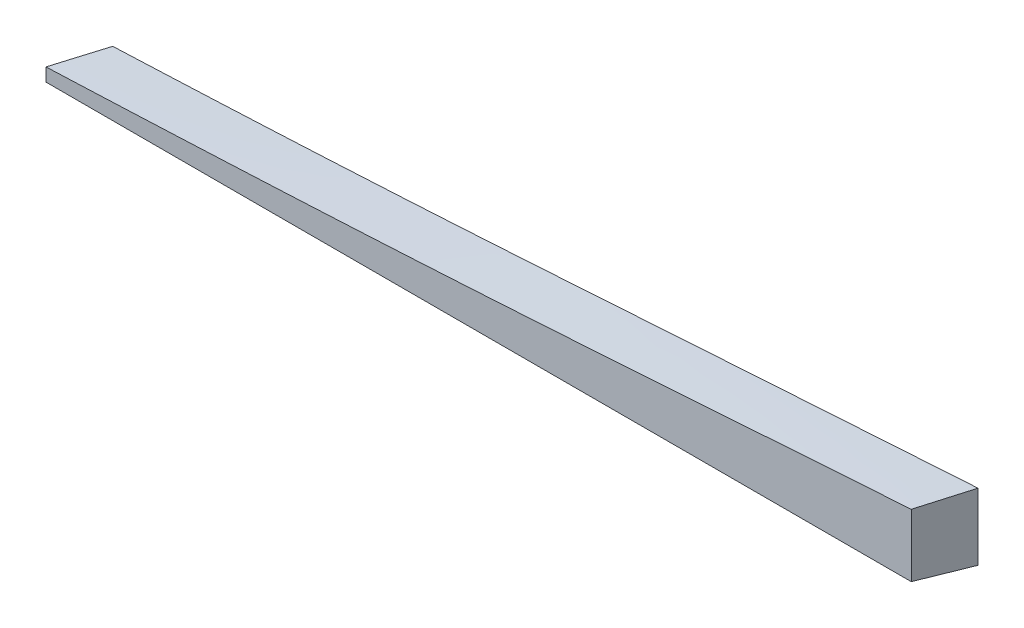
ISO-10303-21;
HEADER;
FILE_DESCRIPTION(('STEP AP214'),'2;1');
FILE_NAME('part.step','',(''),(''),'','','');
FILE_SCHEMA(('AUTOMOTIVE_DESIGN { 1 0 10303 214 1 1 1 1 }'));
ENDSEC;
DATA;
#1=APPLICATION_CONTEXT('core data for automotive mechanical design processes');
#2=APPLICATION_PROTOCOL_DEFINITION('international standard','automotive_design',2000,#1);
#3=PRODUCT_CONTEXT('',#1,'mechanical');
#4=PRODUCT('Part','Part','',(#3));
#5=PRODUCT_RELATED_PRODUCT_CATEGORY('part','',(#4));
#6=PRODUCT_DEFINITION_FORMATION('','',#4);
#7=PRODUCT_DEFINITION_CONTEXT('part definition',#1,'design');
#8=PRODUCT_DEFINITION('design','',#6,#7);
#9=PRODUCT_DEFINITION_SHAPE('','',#8);
#10=(LENGTH_UNIT() NAMED_UNIT(*) SI_UNIT(.MILLI.,.METRE.));
#11=(NAMED_UNIT(*) PLANE_ANGLE_UNIT() SI_UNIT($,.RADIAN.));
#12=(NAMED_UNIT(*) SI_UNIT($,.STERADIAN.) SOLID_ANGLE_UNIT());
#13=UNCERTAINTY_MEASURE_WITH_UNIT(LENGTH_MEASURE(1.E-05),#10,'distance_accuracy_value','');
#14=(GEOMETRIC_REPRESENTATION_CONTEXT(3) GLOBAL_UNCERTAINTY_ASSIGNED_CONTEXT((#13)) GLOBAL_UNIT_ASSIGNED_CONTEXT((#10,
#11,#12)) REPRESENTATION_CONTEXT('',''));
#15=CARTESIAN_POINT('',(0.,0.,0.));
#16=DIRECTION('',(0.,0.,1.));
#17=DIRECTION('',(1.,0.,0.));
#18=AXIS2_PLACEMENT_3D('',#15,#16,#17);
#19=CARTESIAN_POINT('',(-197.742614302347,198.003452270729,-9.08995101411847E-13));
#20=DIRECTION('',(0.,0.,-1.));
#21=DIRECTION('',(-1.,0.,0.));
#22=AXIS2_PLACEMENT_3D('',#19,#20,#21);
#23=PLANE('',#22);
#24=CARTESIAN_POINT('',(-197.742614302347,2.8129648914349,-9.12491653418113E-13));
#25=CARTESIAN_POINT('',(-193.850951140928,2.970598903806,-9.1065830887559E-13));
#26=CARTESIAN_POINT('',(-189.959390433493,3.13081655935987,-9.09535325993361E-13));
#27=CARTESIAN_POINT('',(-182.176532112172,3.45764586709549,-9.08454876033607E-13));
#28=CARTESIAN_POINT('',(-178.285234498681,3.62425752870681,-9.08497410674991E-13));
#29=CARTESIAN_POINT('',(-170.502882666963,3.96510501497694,-9.09492803578593E-13));
#30=CARTESIAN_POINT('',(-166.611828456378,4.13934101464326,-9.10445682747141E-13));
#31=CARTESIAN_POINT('',(-158.830114325608,4.49637709232704,-9.07544520795331E-13));
#32=CARTESIAN_POINT('',(-154.939454405229,4.67917716610088,-9.03690482056849E-13));
#33=CARTESIAN_POINT('',(-147.158567150717,5.05419239235506,-9.03810065062905E-13));
#34=CARTESIAN_POINT('',(-143.26833981897,5.24640759440964,-9.07783728027592E-13));
#35=CARTESIAN_POINT('',(-135.488394625437,5.64091834252697,-9.10206475182148E-13));
#36=CARTESIAN_POINT('',(-131.598676763815,5.84321389180216,-9.08655557611417E-13));
#37=CARTESIAN_POINT('',(-123.819868027069,6.25864055648807,-9.09334640895902E-13));
#38=CARTESIAN_POINT('',(-119.930777144604,6.47177153412137,-9.11564593687281E-13));
#39=CARTESIAN_POINT('',(-114.097621039609,6.79997309015596,-9.07710355376294E-13));
#40=CARTESIAN_POINT('',(-112.153315785025,6.91079111918968,-9.05225748264865E-13));
#41=CARTESIAN_POINT('',(-108.264873033624,7.13533107203409,-9.12764454165497E-13));
#42=CARTESIAN_POINT('',(-106.320735536789,7.24905299554175,-9.22787765872354E-13));
#43=CARTESIAN_POINT('',(-101.832633358921,7.51513272768922,-9.26238225673459E-13));
#44=CARTESIAN_POINT('',(-99.2887332785469,7.66858215322048,-9.13588351356553E-13));
#45=CARTESIAN_POINT('',(-94.20126826513,7.98094006469983,-9.04401850976139E-13));
#46=CARTESIAN_POINT('',(-91.657703332123,8.13984855123147,-9.07865226635083E-13));
#47=CARTESIAN_POINT('',(-86.5708797226157,8.46247367310467,-9.10124975810608E-13));
#48=CARTESIAN_POINT('',(-84.0276210460131,8.62619030683763,-9.08921350888552E-13));
#49=CARTESIAN_POINT('',(-78.9413429638491,8.95775494174865,-9.09068852816083E-13));
#50=CARTESIAN_POINT('',(-76.3983235615085,9.12560299225199,-9.10420010182015E-13));
#51=CARTESIAN_POINT('',(-71.3124874369092,9.464342115984,-9.07570192385291E-13));
#52=CARTESIAN_POINT('',(-68.7696707146869,9.63523318976021,-9.03369216223621E-13));
#53=CARTESIAN_POINT('',(-63.6841689786656,9.97897729744824,-9.1462098925975E-13));
#54=CARTESIAN_POINT('',(-61.1414839649294,10.1518303322876,-9.30073747748984E-13));
#55=CARTESIAN_POINT('',(-54.7847643684682,10.5848417786177,-9.38634644505636E-13));
#56=CARTESIAN_POINT('',(-50.9707596162146,10.845437374839,-9.16706291227796E-13));
#57=CARTESIAN_POINT('',(-43.3425819601253,11.3641287405294,-9.01283915997106E-13));
#58=CARTESIAN_POINT('',(-39.5284090563868,11.6222245114251,-9.07789877815203E-13));
#59=CARTESIAN_POINT('',(-33.807046215106,12.0072521836717,-9.09597701010719E-13));
#60=CARTESIAN_POINT('',(-31.8999273256475,12.1352407922212,-9.08875169708536E-13));
#61=CARTESIAN_POINT('',(-28.0856388461497,12.39046056853,-9.09115033115358E-13));
#62=CARTESIAN_POINT('',(-26.1784692561105,12.517691736288,-9.1007742782716E-13));
#63=CARTESIAN_POINT('',(-22.3640799809754,12.7714342623534,-9.07912773738724E-13));
#64=CARTESIAN_POINT('',(-20.456860295824,12.8979456198243,-9.04785720185998E-13));
#65=CARTESIAN_POINT('',(-16.6423777220762,13.150315227023,-9.13204482614435E-13));
#66=CARTESIAN_POINT('',(-14.73511483348,13.2761734767545,-9.24750298514519E-13));
#67=CARTESIAN_POINT('',(-12.827832670275,13.4017385987262,-9.53013709614758E-13));
#68=B_SPLINE_CURVE_WITH_KNOTS('',3,(#24,#25,#26,#27,#28,#29,#30,#31,#32,#33,#34,#35,#36,#37,#38,
#39,#40,#41,#42,#43,#44,#45,#46,#47,#48,#49,#50,#51,#52,#53,#54,#55,#56,#57,#58,#59,#60,#61,#62,
#63,#64,#65,#66,#67),.UNSPECIFIED.,.F.,.F.,(4,2,2,2,2,2,2,2,2,2,2,2,2,2,2,2,2,2,2,2,2,4),(0.,
11.6845656108452,23.3691484541407,35.0539996437825,46.7388450434628,58.4237519749159,
70.1086626301718,81.7934247435949,87.6358053357163,93.4781853181843,101.123751133811,
108.769317766723,116.414881841782,124.060537242098,131.706194018122,139.351854408683,
150.820545616287,162.289230278067,168.023456521248,173.757682773945,179.49191569059,
185.226148575548),.UNSPECIFIED.);
#69=CARTESIAN_POINT('',(-197.742614302347,2.81296489143491,-8.84763182856796E-13));
#70=VERTEX_POINT('',#69);
#71=CARTESIAN_POINT('',(-12.827832670275,13.4017385987261,-9.08995101411847E-13));
#72=VERTEX_POINT('',#71);
#73=EDGE_CURVE('E50',#70,#72,#68,.T.);
#74=ORIENTED_EDGE('',*,*,#73,.F.);
#75=DIRECTION('',(0.,-1.,0.));
#76=VECTOR('',#75,1.);
#77=CARTESIAN_POINT('',(-197.742614302347,198.003452270729,-9.08995101411847E-13));
#78=LINE('',#77,#76);
#79=CARTESIAN_POINT('',(-197.742614302347,0.,-9.08995101411847E-13));
#80=VERTEX_POINT('',#79);
#81=EDGE_CURVE('E58',#70,#80,#78,.T.);
#82=ORIENTED_EDGE('',*,*,#81,.T.);
#83=DIRECTION('',(1.,0.,0.));
#84=VECTOR('',#83,1.);
#85=CARTESIAN_POINT('',(-197.742614302347,0.,-9.08995101411847E-13));
#86=LINE('',#85,#84);
#87=CARTESIAN_POINT('',(-12.827832670275,0.,-9.08995101411847E-13));
#88=VERTEX_POINT('',#87);
#89=EDGE_CURVE('E92',#80,#88,#86,.T.);
#90=ORIENTED_EDGE('',*,*,#89,.T.);
#91=DIRECTION('',(0.,-1.,0.));
#92=VECTOR('',#91,1.);
#93=CARTESIAN_POINT('',(-12.827832670275,198.003452270729,-9.08995101411847E-13));
#94=LINE('',#93,#92);
#95=EDGE_CURVE('E81',#72,#88,#94,.T.);
#96=ORIENTED_EDGE('',*,*,#95,.F.);
#97=EDGE_LOOP('',(#74,#82,#90,#96));
#98=FACE_BOUND('',#97,.T.);
#99=ADVANCED_FACE('F37',(#98),#23,.F.);
#100=CARTESIAN_POINT('',(-12.827832670275,198.003452270729,-9.08995101411847E-13));
#101=DIRECTION('',(-0.927183854566787,0.,-0.374606593415914));
#102=DIRECTION('',(-0.374606593415914,0.,0.927183854566787));
#103=AXIS2_PLACEMENT_3D('',#100,#101,#102);
#104=PLANE('',#103);
#105=CARTESIAN_POINT('',(55.4579622929114,-12.2355937801034,-169.013273388462));
#106=CARTESIAN_POINT('',(54.0571308051934,-8.60514732719382,-165.54609378936));
#107=CARTESIAN_POINT('',(51.0184814142201,-2.46786226068883,-158.02517262962));
#108=CARTESIAN_POINT('',(45.8041521424564,4.76714030137632,-145.119254799694));
#109=CARTESIAN_POINT('',(38.9234282314708,9.23952699906756,-128.088865505627));
#110=CARTESIAN_POINT('',(30.1300986569033,14.0639848646941,-106.324611077859));
#111=CARTESIAN_POINT('',(18.8078079555876,18.3278371209846,-78.300958212475));
#112=CARTESIAN_POINT('',(9.36093531552081,17.7841951964629,-54.9191279351479));
#113=CARTESIAN_POINT('',(-2.59669205365653,15.2071354720517,-25.3229616356465));
#114=CARTESIAN_POINT('',(-12.2538419080908,14.0608222999372,-1.42067698946542));
#115=CARTESIAN_POINT('',(-30.8844858051684,7.32123956202061,44.6917847908712));
#116=CARTESIAN_POINT('',(-70.3636495182564,-3.48123407166318,142.406143881004));
#117=CARTESIAN_POINT('',(-96.9055824868118,-11.6348174747197,208.099733235731));
#118=CARTESIAN_POINT('',(-113.639406371974,-16.8338696421729,249.517400741279));
#119=B_SPLINE_CURVE_WITH_KNOTS('',3,(#105,#106,#107,#108,#109,#110,#111,#112,#113,#114,#115,
#116,#117,#118),.UNSPECIFIED.,.F.,.F.,(4,1,1,1,1,1,1,1,1,1,1,4),(0.,0.0394948802864952,
0.0758203782734546,0.117565574528788,0.181239187941656,0.256865620502935,0.346598051719973,
0.372016828557867,0.495604882179206,0.537891492765754,0.752596323836803,1.),.UNSPECIFIED.);
#120=CARTESIAN_POINT('',(-8.72292621578977,14.284296480979,-10.1600000000009));
#121=VERTEX_POINT('',#120);
#122=EDGE_CURVE('E87',#121,#72,#119,.T.);
#123=ORIENTED_EDGE('',*,*,#122,.T.);
#124=ORIENTED_EDGE('',*,*,#95,.T.);
#125=DIRECTION('',(0.374606593415914,0.,-0.927183854566787));
#126=VECTOR('',#125,1.);
#127=CARTESIAN_POINT('',(-12.827832670275,0.,-9.08995101411847E-13));
#128=LINE('',#127,#126);
#129=CARTESIAN_POINT('',(-8.72292621578977,0.,-10.1600000000009));
#130=VERTEX_POINT('',#129);
#131=EDGE_CURVE('E105',#88,#130,#128,.T.);
#132=ORIENTED_EDGE('',*,*,#131,.T.);
#133=DIRECTION('',(0.,-1.,0.));
#134=VECTOR('',#133,1.);
#135=CARTESIAN_POINT('',(-8.72292621578977,198.003452270729,-10.1600000000009));
#136=LINE('',#135,#134);
#137=EDGE_CURVE('E149',#121,#130,#136,.T.);
#138=ORIENTED_EDGE('',*,*,#137,.F.);
#139=EDGE_LOOP('',(#123,#124,#132,#138));
#140=FACE_BOUND('',#139,.T.);
#141=ADVANCED_FACE('F131',(#140),#104,.F.);
#142=CARTESIAN_POINT('',(-8.72292621578977,198.003452270729,-10.1600000000009));
#143=DIRECTION('',(0.,0.,1.));
#144=DIRECTION('',(1.,0.,0.));
#145=AXIS2_PLACEMENT_3D('',#142,#143,#144);
#146=PLANE('',#145);
#147=CARTESIAN_POINT('',(-8.72292621578978,14.284296480979,-10.1600000000009));
#148=CARTESIAN_POINT('',(-11.3143587305136,14.1210374299961,-10.1600000000009));
#149=CARTESIAN_POINT('',(-13.9057884039131,13.9577330843458,-10.1600000000009));
#150=CARTESIAN_POINT('',(-19.0886336818386,13.6308988818998,-10.1600000000009));
#151=CARTESIAN_POINT('',(-21.6800492863638,13.4673690250908,-10.1600000000009));
#152=CARTESIAN_POINT('',(-26.8628577810833,13.1399488948078,-10.1600000000009));
#153=CARTESIAN_POINT('',(-29.4542506712773,12.9760586213272,-10.1600000000009));
#154=CARTESIAN_POINT('',(-34.637029949751,12.6478273912623,-10.1600000000009));
#155=CARTESIAN_POINT('',(-37.2284163377898,12.4834864308725,-10.1600000000009));
#156=CARTESIAN_POINT('',(-42.4111565119058,12.1542919159894,-10.1600000000009));
#157=CARTESIAN_POINT('',(-45.0025102979836,11.9894383615055,-10.1600000000009));
#158=CARTESIAN_POINT('',(-50.1851801243023,11.6591393240694,-10.1600000000009));
#159=CARTESIAN_POINT('',(-52.7764961645436,11.4936938411236,-10.1600000000009));
#160=CARTESIAN_POINT('',(-57.9590858298187,11.1621086972605,-10.1600000000009));
#161=CARTESIAN_POINT('',(-60.5503594548186,10.9959690358126,-10.1600000000009));
#162=CARTESIAN_POINT('',(-65.7328585741149,10.6629400964496,-10.1600000000009));
#163=CARTESIAN_POINT('',(-68.3240840684103,10.4960508185211,-10.1600000000009));
#164=CARTESIAN_POINT('',(-73.5064999961304,10.1617287174523,-10.1600000000009));
#165=CARTESIAN_POINT('',(-76.0976904295548,9.99429589430674,-10.1600000000009));
#166=CARTESIAN_POINT('',(-79.9844485970235,9.74292607750322,-10.1600000000009));
#167=CARTESIAN_POINT('',(-81.2800234918128,9.65909980122976,-10.1600000000009));
#168=CARTESIAN_POINT('',(-83.8711733761386,9.49144875061907,-10.1600000000009));
#169=CARTESIAN_POINT('',(-85.1667483656751,9.40762397628184,-10.1600000000009));
#170=CARTESIAN_POINT('',(-89.0534915682424,9.1564316101769,-10.1600000000009));
#171=CARTESIAN_POINT('',(-91.6446780964067,8.98934597004608,-10.1600000000009));
#172=CARTESIAN_POINT('',(-96.827188616671,8.65730125483761,-10.1600000000009));
#173=CARTESIAN_POINT('',(-99.4185126088315,8.49234218070395,-10.1600000000009));
#174=CARTESIAN_POINT('',(-105.8252034345,8.08870625543938,-10.1600000000009));
#175=CARTESIAN_POINT('',(-109.640695761392,7.85200613869954,-10.1600000000009));
#176=CARTESIAN_POINT('',(-115.364424034412,7.50501342356376,-10.1600000000009));
#177=CARTESIAN_POINT('',(-117.272415812547,7.39069205337269,-10.1600000000009));
#178=CARTESIAN_POINT('',(-121.088572059878,7.16496748653493,-10.1600000000009));
#179=CARTESIAN_POINT('',(-122.996736529067,7.05356428974446,-10.1600000000009));
#180=CARTESIAN_POINT('',(-126.813247749074,6.83392154272504,-10.1600000000009));
#181=CARTESIAN_POINT('',(-128.721594499906,6.72568199272073,-10.1600000000009));
#182=CARTESIAN_POINT('',(-132.538465341782,6.51237539015178,-10.1600000000009));
#183=CARTESIAN_POINT('',(-134.446989432837,6.40730833777735,-10.1600000000009));
#184=CARTESIAN_POINT('',(-138.264203645515,6.20018192657645,-10.1600000000009));
#185=CARTESIAN_POINT('',(-140.172893767383,6.09812257227425,-10.1600000000009));
#186=CARTESIAN_POINT('',(-143.99042647996,5.89690005523218,-10.1600000000009));
#187=CARTESIAN_POINT('',(-145.899269070668,5.79773689246565,-10.1600000000009));
#188=CARTESIAN_POINT('',(-151.626315657348,5.50448767097148,-10.1600000000009));
#189=CARTESIAN_POINT('',(-155.444738319136,5.31465814264563,-10.1600000000009));
#190=CARTESIAN_POINT('',(-163.082104182065,4.9456173113248,-10.1600000000009));
#191=CARTESIAN_POINT('',(-166.90104738438,4.76640603270158,-10.1600000000009));
#192=CARTESIAN_POINT('',(-174.539390018035,4.41780475220412,-10.1600000000009));
#193=CARTESIAN_POINT('',(-178.358789450412,4.24841477309299,-10.1600000000009));
#194=CARTESIAN_POINT('',(-185.997974987486,3.9185263892145,-10.1600000000009));
#195=CARTESIAN_POINT('',(-189.817761092419,3.75802798988253,-10.1600000000009));
#196=CARTESIAN_POINT('',(-193.637707845141,3.60151040718567,-10.1600000000009));
#197=B_SPLINE_CURVE_WITH_KNOTS('',3,(#147,#148,#149,#150,#151,#152,#153,#154,#155,#156,#157,
#158,#159,#160,#161,#162,#163,#164,#165,#166,#167,#168,#169,#170,#171,#172,#173,#174,#175,#176,
#177,#178,#179,#180,#181,#182,#183,#184,#185,#186,#187,#188,#189,#190,#191,#192,#193,#194,#195,
#196),.UNSPECIFIED.,.F.,.F.,(4,2,2,2,2,2,2,2,2,2,2,2,2,2,2,2,2,2,2,2,2,2,2,2,4),(0.,
7.78971015274167,15.5794207665583,23.3691315232931,31.1589082581738,38.948684849806,
46.7384613568455,54.5282438171503,62.3180264164862,70.1078090907359,74.0026608615488,
77.8975126641738,85.6872160253848,93.4769228444056,104.945391925423,110.67963081324,
116.413869418494,122.148108430922,127.882347787153,133.616595768571,139.350843697223,
150.820241317958,162.28966526306,173.759115790114,185.228573328339),.UNSPECIFIED.);
#198=CARTESIAN_POINT('',(-193.637707847862,3.60151040707415,-10.1600000000009));
#199=VERTEX_POINT('',#198);
#200=EDGE_CURVE('E11',#121,#199,#197,.T.);
#201=ORIENTED_EDGE('',*,*,#200,.F.);
#202=ORIENTED_EDGE('',*,*,#137,.T.);
#203=DIRECTION('',(-1.,0.,0.));
#204=VECTOR('',#203,1.);
#205=CARTESIAN_POINT('',(-8.72292621578977,0.,-10.1600000000009));
#206=LINE('',#205,#204);
#207=CARTESIAN_POINT('',(-193.637707847862,0.,-10.1600000000009));
#208=VERTEX_POINT('',#207);
#209=EDGE_CURVE('E151',#130,#208,#206,.T.);
#210=ORIENTED_EDGE('',*,*,#209,.T.);
#211=DIRECTION('',(0.,-1.,0.));
#212=VECTOR('',#211,1.);
#213=CARTESIAN_POINT('',(-193.637707847862,198.003452270729,-10.1600000000009));
#214=LINE('',#213,#212);
#215=EDGE_CURVE('E64',#199,#208,#214,.T.);
#216=ORIENTED_EDGE('',*,*,#215,.F.);
#217=EDGE_LOOP('',(#201,#202,#210,#216));
#218=FACE_BOUND('',#217,.T.);
#219=ADVANCED_FACE('F134',(#218),#146,.F.);
#220=CARTESIAN_POINT('',(-193.637707847862,198.003452270729,-10.1600000000009));
#221=DIRECTION('',(0.927183854566786,0.,0.374606593415915));
#222=DIRECTION('',(0.374606593415915,0.,-0.927183854566786));
#223=AXIS2_PLACEMENT_3D('',#220,#221,#222);
#224=PLANE('',#223);
#225=CARTESIAN_POINT('',(-156.781666499846,-1237.73312656953,-101.38190340944));
#226=DIRECTION('',(0.927183854566786,0.,0.374606593415916));
#227=DIRECTION('',(0.374606593415916,0.,-0.927183854566786));
#228=AXIS2_PLACEMENT_3D('',#225,#226,#227);
#229=ELLIPSE('',#228,1342.43267001044,1244.68189747666);
#230=EDGE_CURVE('E102',#199,#70,#229,.T.);
#231=ORIENTED_EDGE('',*,*,#230,.F.);
#232=ORIENTED_EDGE('',*,*,#215,.T.);
#233=DIRECTION('',(-0.374606593415915,0.,0.927183854566786));
#234=VECTOR('',#233,1.);
#235=CARTESIAN_POINT('',(-193.637707847862,0.,-10.1600000000009));
#236=LINE('',#235,#234);
#237=EDGE_CURVE('E97',#208,#80,#236,.T.);
#238=ORIENTED_EDGE('',*,*,#237,.T.);
#239=ORIENTED_EDGE('',*,*,#81,.F.);
#240=EDGE_LOOP('',(#231,#232,#238,#239));
#241=FACE_BOUND('',#240,.T.);
#242=ADVANCED_FACE('F98',(#241),#224,.F.);
#243=CARTESIAN_POINT('',(0.,0.,0.));
#244=DIRECTION('',(0.,1.,0.));
#245=DIRECTION('',(0.,0.,1.));
#246=AXIS2_PLACEMENT_3D('',#243,#244,#245);
#247=PLANE('',#246);
#248=ORIENTED_EDGE('',*,*,#89,.F.);
#249=ORIENTED_EDGE('',*,*,#237,.F.);
#250=ORIENTED_EDGE('',*,*,#209,.F.);
#251=ORIENTED_EDGE('',*,*,#131,.F.);
#252=EDGE_LOOP('',(#248,#249,#250,#251));
#253=FACE_BOUND('',#252,.T.);
#254=ADVANCED_FACE('F104',(#253),#247,.F.);
#255=CARTESIAN_POINT('',(-113.639406371974,-16.8338696421729,249.517400741279));
#256=CARTESIAN_POINT('',(-244.734031016369,-12.2355939291147,116.307837732281));
#257=CARTESIAN_POINT('',(-110.795301709569,-15.9502312932206,242.477994681619));
#258=CARTESIAN_POINT('',(-242.852280123001,-11.4082652181231,111.6503408347));
#259=CARTESIAN_POINT('',(-105.096607861804,-14.1825006641445,228.373232457372));
#260=CARTESIAN_POINT('',(-239.092679703032,-9.80996008523214,102.345003261136));
#261=CARTESIAN_POINT('',(-96.5205219378751,-11.542326983895,207.146674933288));
#262=CARTESIAN_POINT('',(-233.462665592157,-7.5792023326265,88.4102293507615));
#263=CARTESIAN_POINT('',(-87.9199023629598,-8.9275409933963,185.859394492181));
#264=CARTESIAN_POINT('',(-227.839720419136,-5.51278760620607,74.4929516755374));
#265=CARTESIAN_POINT('',(-80.735369044079,-6.77993153840772,168.077050526688));
#266=CARTESIAN_POINT('',(-223.15789223881,-3.92576375555536,62.9050202964586));
#267=CARTESIAN_POINT('',(-74.9793414975477,-5.0845868337294,153.830382418366));
#268=CARTESIAN_POINT('',(-219.413646582251,-2.73595926758175,53.6376870959499));
#269=CARTESIAN_POINT('',(-70.6586550115046,-3.82488728155374,143.136308099028));
#270=CARTESIAN_POINT('',(-216.605795792343,-1.88339107047646,46.688012519493));
#271=CARTESIAN_POINT('',(-66.3348513196053,-2.57712188799768,132.434518424455));
#272=CARTESIAN_POINT('',(-213.798003463604,-1.07048591484751,39.7384826395085));
#273=CARTESIAN_POINT('',(-62.0084771173339,-1.34159901206769,121.726366513454));
#274=CARTESIAN_POINT('',(-210.989994604694,-0.297121673296326,32.7884168285439));
#275=CARTESIAN_POINT('',(-57.6803144087181,-0.112749280524949,111.013787893912));
#276=CARTESIAN_POINT('',(-208.181494224272,0.436823781575647,25.8371344591469));
#277=CARTESIAN_POINT('',(-53.3511435517895,1.11500910210804,100.298714019736));
#278=CARTESIAN_POINT('',(-205.372227330998,1.13147257716699,18.8839549038651));
#279=CARTESIAN_POINT('',(-49.0217168456153,2.34654578322212,89.5830068964547));
#280=CARTESIAN_POINT('',(-202.561918933529,1.78694684087628,11.928197535246));
#281=CARTESIAN_POINT('',(-44.6928013054192,3.58703277621048,78.8685649533659));
#282=CARTESIAN_POINT('',(-199.750294040527,2.40336870010207,4.96918172583737));
#283=CARTESIAN_POINT('',(-41.0864535806247,4.63287089018254,69.9425411108795));
#284=CARTESIAN_POINT('',(-197.405947057295,2.88461168521947,-0.833280672204839));
#285=CARTESIAN_POINT('',(-38.2024491395383,5.48023732544504,62.8043796335523));
#286=CARTESIAN_POINT('',(-195.529532058099,3.25012877705462,-5.47757076826763));
#287=CARTESIAN_POINT('',(-36.0400971107482,6.12213829728261,57.452370554636));
#288=CARTESIAN_POINT('',(-194.121716685104,3.51452490837254,-8.96203609000623));
#289=CARTESIAN_POINT('',(-33.8785208259551,6.77164999324718,52.1022815094881));
#290=CARTESIAN_POINT('',(-192.713361771216,3.76917631270293,-12.4478368223134));
#291=CARTESIAN_POINT('',(-31.7178485070943,7.43007092686473,46.7544298585355));
#292=CARTESIAN_POINT('',(-191.304431899144,4.01407995061671,-15.935060626066));
#293=CARTESIAN_POINT('',(-29.5582401527965,8.09934698826073,41.4092116122849));
#294=CARTESIAN_POINT('',(-189.894891651592,4.24923278268483,-19.4237951621413));
#295=CARTESIAN_POINT('',(-27.3998444376375,8.78113491398388,36.0669947532249));
#296=CARTESIAN_POINT('',(-188.484705611269,4.47463176947819,-22.914128091416));
#297=CARTESIAN_POINT('',(-25.2429069653095,9.4790571065996,30.728387171825));
#298=CARTESIAN_POINT('',(-187.073838360881,4.69027387156773,-26.4061470747673));
#299=CARTESIAN_POINT('',(-23.0875925354111,10.1948686275091,25.3937967614052));
#300=CARTESIAN_POINT('',(-185.662254483135,4.89615604952437,-29.8999397730722));
#301=CARTESIAN_POINT('',(-20.9344424098899,10.9379382283173,20.0645631922961));
#302=CARTESIAN_POINT('',(-184.249918560736,5.09227526391904,-33.3955938472077));
#303=CARTESIAN_POINT('',(-18.7822903868663,11.6818912571797,14.7378000135571));
#304=CARTESIAN_POINT('',(-182.836795176393,5.27862847532266,-36.8931969580507));
#305=CARTESIAN_POINT('',(-16.6291758215125,12.3852525933448,9.40865445895077));
#306=CARTESIAN_POINT('',(-181.422848912812,5.45521264430617,-40.3928367664783));
#307=CARTESIAN_POINT('',(-14.4733022842368,12.9997964098259,4.07268020921187));
#308=CARTESIAN_POINT('',(-180.008044352699,5.62202473144047,-43.8946009333675));
#309=CARTESIAN_POINT('',(-12.3155602674426,13.5331243649529,-1.26791868961935));
#310=CARTESIAN_POINT('',(-178.592346078761,5.77906169729651,-47.3985771195952));
#311=CARTESIAN_POINT('',(-10.1570214500323,14.0046036674132,-6.6104897391804));
#312=CARTESIAN_POINT('',(-177.175718673705,5.9263205024452,-50.9048529860387));
#313=CARTESIAN_POINT('',(-7.99837217427837,14.4283592517911,-11.9533341827355));
#314=CARTESIAN_POINT('',(-175.758126720237,6.06379810745748,-54.4135161935747));
#315=CARTESIAN_POINT('',(-5.84023606775474,14.8207557505574,-17.2949084878751));
#316=CARTESIAN_POINT('',(-174.339530481487,6.19147055645653,-57.9246650944117));
#317=CARTESIAN_POINT('',(-3.68307926215605,15.1962510000121,-22.6340589381698));
#318=CARTESIAN_POINT('',(-172.919890220581,6.30931389356557,-61.4383980407584));
#319=CARTESIAN_POINT('',(-1.52736012198691,15.5705412481707,-27.9696510416602));
#320=CARTESIAN_POINT('',(-171.49916620065,6.41730416290778,-64.9548133848231));
#321=CARTESIAN_POINT('',(0.626529722134696,15.9572292268476,-33.3007154785524));
#322=CARTESIAN_POINT('',(-170.077318684821,6.51541740860637,-68.4740094788143));
#323=CARTESIAN_POINT('',(2.77804144270615,16.3739991983538,-38.6258938531098));
#324=CARTESIAN_POINT('',(-168.654307936223,6.60362967478453,-71.9960846749405));
#325=CARTESIAN_POINT('',(4.92695075268841,16.8242706710665,-43.9446310354308));
#326=CARTESIAN_POINT('',(-167.230094217983,6.68191700556546,-75.5211373254103));
#327=CARTESIAN_POINT('',(7.07560334163652,17.2226378645503,-49.262732810895));
#328=CARTESIAN_POINT('',(-165.804637793231,6.75025544507236,-79.049265782432));
#329=CARTESIAN_POINT('',(9.22467108891368,17.5282660272677,-54.5818621392816));
#330=CARTESIAN_POINT('',(-164.377898925095,6.80862103742844,-82.5805683982141));
#331=CARTESIAN_POINT('',(12.0898744330558,17.7990674548653,-61.6734892687321));
#332=CARTESIAN_POINT('',(-162.473817527238,6.87311275653303,-87.2933352338822));
#333=CARTESIAN_POINT('',(15.6695495433728,17.8513526959539,-70.5334960737791));
#334=CARTESIAN_POINT('',(-160.0903109871,6.9286755081527,-93.1927209364108));
#335=CARTESIAN_POINT('',(19.9535850198831,17.3459501914322,-81.1368559612587));
#336=CARTESIAN_POINT('',(-157.224337575451,6.95507612746414,-100.286254049823));
#337=CARTESIAN_POINT('',(22.7922515197779,16.5844611671308,-88.1628020963813));
#338=CARTESIAN_POINT('',(-155.309632995382,6.94569898724073,-105.025314184127));
#339=CARTESIAN_POINT('',(26.1351459531572,15.495920563644,-96.436756160797));
#340=CARTESIAN_POINT('',(-153.043819055665,6.91859463696319,-110.633400478609));
#341=CARTESIAN_POINT('',(29.8080111488846,14.0000270674216,-105.527416521112));
#342=CARTESIAN_POINT('',(-150.34011037674,6.65919371585887,-117.325314285284));
#343=CARTESIAN_POINT('',(35.0373098473499,11.3812529373059,-118.47038498227));
#344=CARTESIAN_POINT('',(-146.098399949941,5.46323583478356,-127.823915998652));
#345=CARTESIAN_POINT('',(40.1407072358348,8.43132589110986,-131.101736766268));
#346=CARTESIAN_POINT('',(-141.804409987639,3.4059624315028,-138.451914103047));
#347=CARTESIAN_POINT('',(43.5624995109594,6.21625294056347,-139.57096984155));
#348=CARTESIAN_POINT('',(-139.013961203788,1.49672773225872,-145.35851720309));
#349=CARTESIAN_POINT('',(45.7281681653696,4.18884813751616,-144.931187856937));
#350=CARTESIAN_POINT('',(-137.277829452192,0.132816177567437,-149.655594077262));
#351=CARTESIAN_POINT('',(46.6603509624716,3.23210036336007,-147.238421243025));
#352=CARTESIAN_POINT('',(-136.511806213556,-0.533721522561419,-151.551568124622));
#353=CARTESIAN_POINT('',(48.4540544790406,1.05192782094857,-151.677993235811));
#354=CARTESIAN_POINT('',(-134.990232122236,-2.12900890756067,-155.317596154547));
#355=CARTESIAN_POINT('',(50.5889483584982,-2.11965028540233,-156.962041010295));
#356=CARTESIAN_POINT('',(-133.144700679707,-4.60732592780855,-159.885446765517));
#357=CARTESIAN_POINT('',(53.0618198171726,-6.58766915193156,-163.082612647849));
#358=CARTESIAN_POINT('',(-131.136185731317,-8.20552944956003,-164.856695709166));
#359=CARTESIAN_POINT('',(54.6677511617164,-10.1876535221571,-167.057432206218));
#360=CARTESIAN_POINT('',(-129.98335755533,-10.871565218128,-167.710045571799));
#361=CARTESIAN_POINT('',(55.4579622929114,-12.2355937801034,-169.013273388462));
#362=CARTESIAN_POINT('',(-129.457038163684,-12.2355939291149,-169.012731778762));
#363=B_SPLINE_SURFACE_WITH_KNOTS('',3,1,((#255,#256),(#257,#258),(#259,#260),(#261,#262),(#263,
#264),(#265,#266),(#267,#268),(#269,#270),(#271,#272),(#273,#274),(#275,#276),(#277,#278),(#279,
#280),(#281,#282),(#283,#284),(#285,#286),(#287,#288),(#289,#290),(#291,#292),(#293,#294),(#295,
#296),(#297,#298),(#299,#300),(#301,#302),(#303,#304),(#305,#306),(#307,#308),(#309,#310),(#311,
#312),(#313,#314),(#315,#316),(#317,#318),(#319,#320),(#321,#322),(#323,#324),(#325,#326),(#327,
#328),(#329,#330),(#331,#332),(#333,#334),(#335,#336),(#337,#338),(#339,#340),(#341,#342),(#343,
#344),(#345,#346),(#347,#348),(#349,#350),(#351,#352),(#353,#354),(#355,#356),(#357,#358),(#359,
#360),(#361,#362)),.UNSPECIFIED.,.F.,.F.,.F.,(4,1,1,1,1,1,1,1,1,1,1,1,1,1,1,1,1,1,1,1,1,1,1,1,1,
1,1,1,1,1,1,1,1,1,1,1,1,1,1,1,2,1,1,1,2,1,1,1,1,4),(2,2),(0.,0.0493417510349712,
0.0986835020699424,0.148025253104914,0.197367004139885,0.22203787965737,0.246708755174856,
0.271379630692342,0.296050506209827,0.320721381727313,0.345392257244798,0.370063132762284,
0.39473400827977,0.419404883797255,0.431740321555998,0.444075759314741,0.456411197073483,
0.468746634832226,0.481082072590969,0.493417510349712,0.505752948108455,0.518088385867198,
0.53042382362594,0.542759261384683,0.555094699143426,0.567430136902169,0.579765574660911,
0.592101012419654,0.604436450178397,0.61677188793714,0.629107325695883,0.641442763454626,
0.653778201213368,0.666113638972111,0.678449076730854,0.690784514489597,0.70311995224834,
0.715455390007082,0.740126265524568,0.764797141042053,0.789468016559539,0.823121947855717,
0.856775879151895,0.890429810448073,0.924083741744251,0.93357327402622,0.943062806308189,
0.962041870872126,0.981020935436063,1.),(0.,1.),.UNSPECIFIED.);
#364=ORIENTED_EDGE('',*,*,#230,.T.);
#365=ORIENTED_EDGE('',*,*,#73,.T.);
#366=ORIENTED_EDGE('',*,*,#122,.F.);
#367=ORIENTED_EDGE('',*,*,#200,.T.);
#368=EDGE_LOOP('',(#364,#365,#366,#367));
#369=FACE_BOUND('',#368,.T.);
#370=ADVANCED_FACE('F39',(#369),#363,.T.);
#371=CLOSED_SHELL('',(#99,#141,#219,#242,#254,#370));
#372=MANIFOLD_SOLID_BREP('B2',#371);
#373=ADVANCED_BREP_SHAPE_REPRESENTATION('',(#18,#372),#14);
#374=SHAPE_DEFINITION_REPRESENTATION(#9,#373);
ENDSEC;
END-ISO-10303-21;
